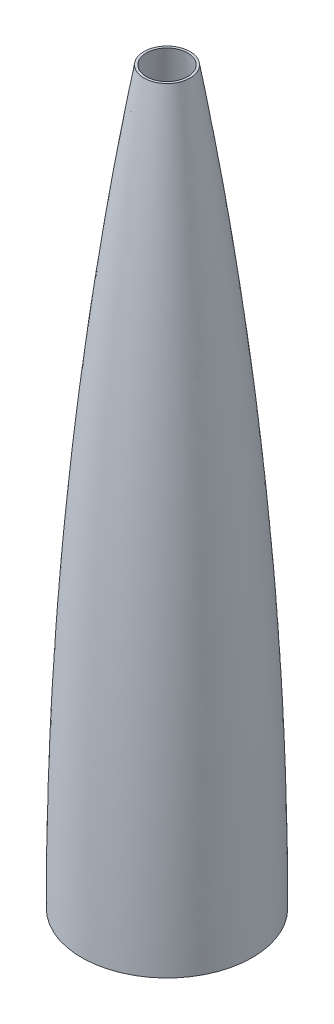
ISO-10303-21;
HEADER;
FILE_DESCRIPTION(('STEP AP214'),'2;1');
FILE_NAME('part.step','',(''),(''),'','','');
FILE_SCHEMA(('AUTOMOTIVE_DESIGN { 1 0 10303 214 1 1 1 1 }'));
ENDSEC;
DATA;
#1=APPLICATION_CONTEXT('core data for automotive mechanical design processes');
#2=APPLICATION_PROTOCOL_DEFINITION('international standard','automotive_design',2000,#1);
#3=PRODUCT_CONTEXT('',#1,'mechanical');
#4=PRODUCT('Part','Part','',(#3));
#5=PRODUCT_RELATED_PRODUCT_CATEGORY('part','',(#4));
#6=PRODUCT_DEFINITION_FORMATION('','',#4);
#7=PRODUCT_DEFINITION_CONTEXT('part definition',#1,'design');
#8=PRODUCT_DEFINITION('design','',#6,#7);
#9=PRODUCT_DEFINITION_SHAPE('','',#8);
#10=(LENGTH_UNIT() NAMED_UNIT(*) SI_UNIT(.MILLI.,.METRE.));
#11=(NAMED_UNIT(*) PLANE_ANGLE_UNIT() SI_UNIT($,.RADIAN.));
#12=(NAMED_UNIT(*) SI_UNIT($,.STERADIAN.) SOLID_ANGLE_UNIT());
#13=UNCERTAINTY_MEASURE_WITH_UNIT(LENGTH_MEASURE(1.E-05),#10,'distance_accuracy_value','');
#14=(GEOMETRIC_REPRESENTATION_CONTEXT(3) GLOBAL_UNCERTAINTY_ASSIGNED_CONTEXT((#13)) GLOBAL_UNIT_ASSIGNED_CONTEXT((#10,
#11,#12)) REPRESENTATION_CONTEXT('',''));
#15=CARTESIAN_POINT('',(0.,0.,0.));
#16=DIRECTION('',(0.,0.,1.));
#17=DIRECTION('',(1.,0.,0.));
#18=AXIS2_PLACEMENT_3D('',#15,#16,#17);
#19=CARTESIAN_POINT('',(78.36,0.,0.));
#20=DIRECTION('',(0.,-1.,0.));
#21=DIRECTION('',(0.,0.,-1.));
#22=AXIS2_PLACEMENT_3D('',#19,#20,#21);
#23=PLANE('',#22);
#24=CARTESIAN_POINT('',(0.,0.,0.));
#25=DIRECTION('',(0.,1.,0.));
#26=DIRECTION('',(1.,0.,0.));
#27=AXIS2_PLACEMENT_3D('',#24,#25,#26);
#28=CIRCLE('',#27,76.2);
#29=CARTESIAN_POINT('',(76.2,0.,0.));
#30=VERTEX_POINT('',#29);
#31=CARTESIAN_POINT('',(0.,0.,-76.2));
#32=VERTEX_POINT('',#31);
#33=EDGE_CURVE('E30',#30,#32,#28,.T.);
#34=ORIENTED_EDGE('',*,*,#33,.T.);
#35=CARTESIAN_POINT('',(0.,0.,0.));
#36=DIRECTION('',(0.,1.,0.));
#37=DIRECTION('',(1.,0.,0.));
#38=AXIS2_PLACEMENT_3D('',#35,#36,#37);
#39=CIRCLE('',#38,76.2);
#40=EDGE_CURVE('E11',#32,#30,#39,.T.);
#41=ORIENTED_EDGE('',*,*,#40,.T.);
#42=EDGE_LOOP('',(#34,#41));
#43=FACE_BOUND('',#42,.T.);
#44=CARTESIAN_POINT('',(0.,0.,0.));
#45=DIRECTION('',(0.,1.,0.));
#46=DIRECTION('',(1.,0.,0.));
#47=AXIS2_PLACEMENT_3D('',#44,#45,#46);
#48=CIRCLE('',#47,78.36);
#49=CARTESIAN_POINT('',(78.36,0.,0.));
#50=VERTEX_POINT('',#49);
#51=CARTESIAN_POINT('',(0.,0.,-78.36));
#52=VERTEX_POINT('',#51);
#53=EDGE_CURVE('E72',#50,#52,#48,.T.);
#54=ORIENTED_EDGE('',*,*,#53,.F.);
#55=CARTESIAN_POINT('',(0.,0.,0.));
#56=DIRECTION('',(0.,1.,0.));
#57=DIRECTION('',(1.,0.,0.));
#58=AXIS2_PLACEMENT_3D('',#55,#56,#57);
#59=CIRCLE('',#58,78.36);
#60=EDGE_CURVE('E23',#52,#50,#59,.T.);
#61=ORIENTED_EDGE('',*,*,#60,.F.);
#62=EDGE_LOOP('',(#54,#61));
#63=FACE_BOUND('',#62,.T.);
#64=ADVANCED_FACE('F17',(#43,#63),#23,.T.);
#65=CARTESIAN_POINT('',(0.,0.,-76.2));
#66=CARTESIAN_POINT('',(-76.2000000000001,0.,-76.2000000000001));
#67=CARTESIAN_POINT('',(-76.2,0.,0.));
#68=CARTESIAN_POINT('',(-76.2000000000001,0.,76.2000000000001));
#69=CARTESIAN_POINT('',(0.,0.,76.2));
#70=CARTESIAN_POINT('',(76.2000000000001,0.,76.2000000000001));
#71=CARTESIAN_POINT('',(76.2,0.,0.));
#72=CARTESIAN_POINT('',(76.2000000000001,0.,-76.2000000000001));
#73=CARTESIAN_POINT('',(0.,0.,-76.2));
#74=CARTESIAN_POINT('',(0.,337.744689922215,-76.1999999999987));
#75=CARTESIAN_POINT('',(-76.1999999999986,337.744689922215,-76.1999999999986));
#76=CARTESIAN_POINT('',(-76.1999999999987,337.744689922215,0.));
#77=CARTESIAN_POINT('',(-76.1999999999986,337.744689922215,76.1999999999986));
#78=CARTESIAN_POINT('',(0.,337.744689922215,76.1999999999987));
#79=CARTESIAN_POINT('',(76.1999999999986,337.744689922215,76.1999999999986));
#80=CARTESIAN_POINT('',(76.1999999999987,337.744689922215,0.));
#81=CARTESIAN_POINT('',(76.1999999999986,337.744689922215,-76.1999999999986));
#82=CARTESIAN_POINT('',(0.,337.744689922215,-76.1999999999987));
#83=CARTESIAN_POINT('',(0.,670.599,-18.9332222549689));
#84=CARTESIAN_POINT('',(-18.9332222549689,670.599000000002,-18.9332222549689));
#85=CARTESIAN_POINT('',(-18.9332222549689,670.599,0.));
#86=CARTESIAN_POINT('',(-18.9332222549689,670.599000000002,18.9332222549689));
#87=CARTESIAN_POINT('',(0.,670.599,18.9332222549689));
#88=CARTESIAN_POINT('',(18.9332222549689,670.599000000002,18.9332222549689));
#89=CARTESIAN_POINT('',(18.9332222549689,670.599,0.));
#90=CARTESIAN_POINT('',(18.9332222549689,670.599000000002,-18.9332222549689));
#91=CARTESIAN_POINT('',(0.,670.599,-18.9332222549689));
#92=(BOUNDED_SURFACE() B_SPLINE_SURFACE(2,2,((#65,#66,#67,#68,#69,#70,#71,#72,#73),(#74,#75,#76,
#77,#78,#79,#80,#81,#82),(#83,#84,#85,#86,#87,#88,#89,#90,#91)),.UNSPECIFIED.,.F.,.T.,
.F.) B_SPLINE_SURFACE_WITH_KNOTS((3,3),(3,2,2,2,3),(0.,0.170379546226382),(-3.14159265358979,
-1.5707963267949,0.,1.5707963267949,3.14159265358979),
.UNSPECIFIED.) GEOMETRIC_REPRESENTATION_ITEM() RATIONAL_B_SPLINE_SURFACE(((1.,0.707106781186548,
1.,0.707106781186548,1.,0.707106781186548,1.,0.707106781186548,1.),(0.996373545262973,
0.704542490450329,0.996373545262973,0.704542490450329,0.996373545262973,0.704542490450329,
0.996373545262973,0.704542490450329,0.996373545262973),(1.,0.707106781186548,1.,
0.707106781186548,1.,0.707106781186548,1.,0.707106781186548,1.))) REPRESENTATION_ITEM('') SURFACE());
#93=CARTESIAN_POINT('',(0.,670.599,0.));
#94=DIRECTION('',(0.,1.,0.));
#95=DIRECTION('',(1.,0.,0.));
#96=AXIS2_PLACEMENT_3D('',#93,#94,#95);
#97=CIRCLE('',#96,18.9332222549695);
#98=CARTESIAN_POINT('',(18.9332222549695,670.599,0.));
#99=VERTEX_POINT('',#98);
#100=CARTESIAN_POINT('',(0.,670.599,-18.9332222549695));
#101=VERTEX_POINT('',#100);
#102=EDGE_CURVE('E78',#99,#101,#97,.T.);
#103=CARTESIAN_POINT('',(4.75018449746896E-13,-1.82609483090346E-11,3878.82000000018));
#104=DIRECTION('',(-1.,0.,0.));
#105=DIRECTION('',(0.,0.,-1.));
#106=AXIS2_PLACEMENT_3D('',#103,#104,#105);
#107=CIRCLE('',#106,3955.02000000018);
#108=EDGE_CURVE('E96',#101,#32,#107,.T.);
#109=CARTESIAN_POINT('',(0.,670.599,0.));
#110=DIRECTION('',(0.,1.,0.));
#111=DIRECTION('',(1.,0.,0.));
#112=AXIS2_PLACEMENT_3D('',#109,#110,#111);
#113=CIRCLE('',#112,18.9332222549695);
#114=EDGE_CURVE('E64',#101,#99,#113,.T.);
#115=ORIENTED_EDGE('',*,*,#102,.T.);
#116=ORIENTED_EDGE('',*,*,#108,.T.);
#117=ORIENTED_EDGE('',*,*,#33,.F.);
#118=ORIENTED_EDGE('',*,*,#40,.F.);
#119=ORIENTED_EDGE('',*,*,#108,.F.);
#120=ORIENTED_EDGE('',*,*,#114,.T.);
#121=EDGE_LOOP('',(#115,#116,#117,#118,#119,#120));
#122=FACE_BOUND('',#121,.T.);
#123=ADVANCED_FACE('F161',(#122),#92,.T.);
#124=CARTESIAN_POINT('',(18.9332222549695,670.599,0.));
#125=DIRECTION('',(0.,1.,0.));
#126=DIRECTION('',(1.,0.,0.));
#127=AXIS2_PLACEMENT_3D('',#124,#125,#126);
#128=PLANE('',#127);
#129=ORIENTED_EDGE('',*,*,#102,.F.);
#130=ORIENTED_EDGE('',*,*,#114,.F.);
#131=EDGE_LOOP('',(#129,#130));
#132=FACE_BOUND('',#131,.T.);
#133=CARTESIAN_POINT('',(0.,670.599,0.));
#134=DIRECTION('',(0.,1.,0.));
#135=DIRECTION('',(1.,0.,0.));
#136=AXIS2_PLACEMENT_3D('',#133,#134,#135);
#137=CIRCLE('',#136,21.1249398163301);
#138=CARTESIAN_POINT('',(21.1249398163301,670.599,0.));
#139=VERTEX_POINT('',#138);
#140=CARTESIAN_POINT('',(0.,670.599,-21.1249398163301));
#141=VERTEX_POINT('',#140);
#142=EDGE_CURVE('E91',#139,#141,#137,.T.);
#143=ORIENTED_EDGE('',*,*,#142,.T.);
#144=CARTESIAN_POINT('',(0.,670.599,0.));
#145=DIRECTION('',(0.,1.,0.));
#146=DIRECTION('',(1.,0.,0.));
#147=AXIS2_PLACEMENT_3D('',#144,#145,#146);
#148=CIRCLE('',#147,21.1249398163301);
#149=EDGE_CURVE('E87',#141,#139,#148,.T.);
#150=ORIENTED_EDGE('',*,*,#149,.T.);
#151=EDGE_LOOP('',(#143,#150));
#152=FACE_BOUND('',#151,.T.);
#153=ADVANCED_FACE('F108',(#132,#152),#128,.T.);
#154=CARTESIAN_POINT('',(0.,0.,-78.36));
#155=CARTESIAN_POINT('',(-78.3600000000001,0.,-78.3600000000001));
#156=CARTESIAN_POINT('',(-78.36,0.,0.));
#157=CARTESIAN_POINT('',(-78.3600000000001,0.,78.3600000000001));
#158=CARTESIAN_POINT('',(0.,0.,78.36));
#159=CARTESIAN_POINT('',(78.3600000000001,0.,78.3600000000001));
#160=CARTESIAN_POINT('',(78.36,0.,0.));
#161=CARTESIAN_POINT('',(78.3600000000001,0.,-78.3600000000001));
#162=CARTESIAN_POINT('',(0.,0.,-78.36));
#163=CARTESIAN_POINT('',(0.,337.741982104971,-78.3599999999988));
#164=CARTESIAN_POINT('',(-78.3599999999987,337.741982104971,-78.3599999999987));
#165=CARTESIAN_POINT('',(-78.3599999999988,337.741982104971,0.));
#166=CARTESIAN_POINT('',(-78.3599999999987,337.741982104971,78.3599999999987));
#167=CARTESIAN_POINT('',(0.,337.741982104971,78.3599999999988));
#168=CARTESIAN_POINT('',(78.3599999999987,337.741982104971,78.3599999999987));
#169=CARTESIAN_POINT('',(78.3599999999988,337.741982104971,0.));
#170=CARTESIAN_POINT('',(78.3599999999987,337.741982104971,-78.3599999999987));
#171=CARTESIAN_POINT('',(0.,337.741982104971,-78.3599999999988));
#172=CARTESIAN_POINT('',(0.,670.599,-21.1249398163295));
#173=CARTESIAN_POINT('',(-21.1249398163295,670.599000000002,-21.1249398163295));
#174=CARTESIAN_POINT('',(-21.1249398163295,670.599,0.));
#175=CARTESIAN_POINT('',(-21.1249398163295,670.599000000002,21.1249398163295));
#176=CARTESIAN_POINT('',(0.,670.599,21.1249398163295));
#177=CARTESIAN_POINT('',(21.1249398163295,670.599000000002,21.1249398163295));
#178=CARTESIAN_POINT('',(21.1249398163295,670.599,0.));
#179=CARTESIAN_POINT('',(21.1249398163295,670.599000000002,-21.1249398163295));
#180=CARTESIAN_POINT('',(0.,670.599,-21.1249398163295));
#181=(BOUNDED_SURFACE() B_SPLINE_SURFACE(2,2,((#154,#155,#156,#157,#158,#159,#160,#161,#162),
(#163,#164,#165,#166,#167,#168,#169,#170,#171),(#172,#173,#174,#175,#176,#177,#178,#179,#180)),
.UNSPECIFIED.,.F.,.T.,.F.) B_SPLINE_SURFACE_WITH_KNOTS((3,3),(3,2,2,2,3),(0.,0.170285635975637),
(-3.14159265358979,-1.5707963267949,0.,1.5707963267949,3.14159265358979),
.UNSPECIFIED.) GEOMETRIC_REPRESENTATION_ITEM() RATIONAL_B_SPLINE_SURFACE(((1.,0.707106781186548,
1.,0.707106781186548,1.,0.707106781186548,1.,0.707106781186548,1.),(0.996377539424466,
0.704545314749007,0.996377539424466,0.704545314749007,0.996377539424466,0.704545314749007,
0.996377539424466,0.704545314749007,0.996377539424466),(1.,0.707106781186548,1.,
0.707106781186548,1.,0.707106781186548,1.,0.707106781186548,1.))) REPRESENTATION_ITEM('') SURFACE());
#182=CARTESIAN_POINT('',(4.75018449746896E-13,-1.82609483090346E-11,3878.82000000018));
#183=DIRECTION('',(-1.,0.,0.));
#184=DIRECTION('',(0.,0.,-1.));
#185=AXIS2_PLACEMENT_3D('',#182,#183,#184);
#186=CIRCLE('',#185,3957.18000000018);
#187=EDGE_CURVE('E82',#141,#52,#186,.T.);
#188=ORIENTED_EDGE('',*,*,#142,.F.);
#189=ORIENTED_EDGE('',*,*,#149,.F.);
#190=ORIENTED_EDGE('',*,*,#187,.T.);
#191=ORIENTED_EDGE('',*,*,#60,.T.);
#192=ORIENTED_EDGE('',*,*,#53,.T.);
#193=ORIENTED_EDGE('',*,*,#187,.F.);
#194=EDGE_LOOP('',(#188,#189,#190,#191,#192,#193));
#195=FACE_BOUND('',#194,.T.);
#196=ADVANCED_FACE('F19',(#195),#181,.F.);
#197=CLOSED_SHELL('',(#64,#123,#153,#196));
#198=MANIFOLD_SOLID_BREP('B1',#197);
#199=ADVANCED_BREP_SHAPE_REPRESENTATION('',(#18,#198),#14);
#200=SHAPE_DEFINITION_REPRESENTATION(#9,#199);
ENDSEC;
END-ISO-10303-21;
